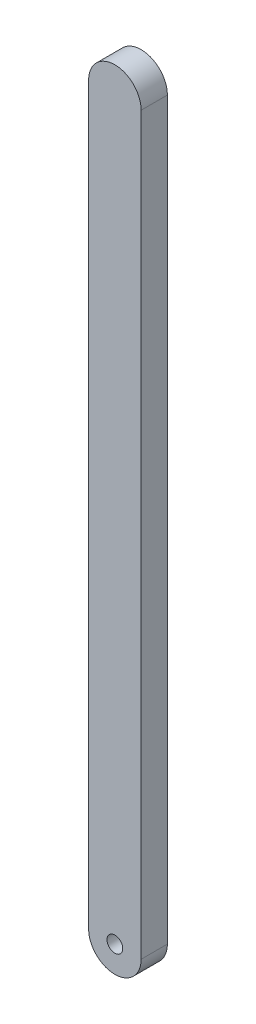
ISO-10303-21;
HEADER;
FILE_DESCRIPTION(('STEP AP214'),'2;1');
FILE_NAME('part.step','',(''),(''),'','','');
FILE_SCHEMA(('AUTOMOTIVE_DESIGN { 1 0 10303 214 1 1 1 1 }'));
ENDSEC;
DATA;
#1=APPLICATION_CONTEXT('core data for automotive mechanical design processes');
#2=APPLICATION_PROTOCOL_DEFINITION('international standard','automotive_design',2000,#1);
#3=PRODUCT_CONTEXT('',#1,'mechanical');
#4=PRODUCT('Part','Part','',(#3));
#5=PRODUCT_RELATED_PRODUCT_CATEGORY('part','',(#4));
#6=PRODUCT_DEFINITION_FORMATION('','',#4);
#7=PRODUCT_DEFINITION_CONTEXT('part definition',#1,'design');
#8=PRODUCT_DEFINITION('design','',#6,#7);
#9=PRODUCT_DEFINITION_SHAPE('','',#8);
#10=(LENGTH_UNIT() NAMED_UNIT(*) SI_UNIT(.MILLI.,.METRE.));
#11=(NAMED_UNIT(*) PLANE_ANGLE_UNIT() SI_UNIT($,.RADIAN.));
#12=(NAMED_UNIT(*) SI_UNIT($,.STERADIAN.) SOLID_ANGLE_UNIT());
#13=UNCERTAINTY_MEASURE_WITH_UNIT(LENGTH_MEASURE(1.E-05),#10,'distance_accuracy_value','');
#14=(GEOMETRIC_REPRESENTATION_CONTEXT(3) GLOBAL_UNCERTAINTY_ASSIGNED_CONTEXT((#13)) GLOBAL_UNIT_ASSIGNED_CONTEXT((#10,
#11,#12)) REPRESENTATION_CONTEXT('',''));
#15=CARTESIAN_POINT('',(0.,0.,0.));
#16=DIRECTION('',(0.,0.,1.));
#17=DIRECTION('',(1.,0.,0.));
#18=AXIS2_PLACEMENT_3D('',#15,#16,#17);
#19=CARTESIAN_POINT('',(0.,70.,0.));
#20=DIRECTION('',(0.,0.,1.));
#21=DIRECTION('',(1.,0.,0.));
#22=AXIS2_PLACEMENT_3D('',#19,#20,#21);
#23=CYLINDRICAL_SURFACE('',#22,2.5);
#24=CARTESIAN_POINT('',(0.,70.,0.));
#25=DIRECTION('',(0.,0.,1.));
#26=DIRECTION('',(1.,0.,0.));
#27=AXIS2_PLACEMENT_3D('',#24,#25,#26);
#28=CIRCLE('',#27,2.5);
#29=CARTESIAN_POINT('',(2.49999999999999,70.,0.));
#30=VERTEX_POINT('',#29);
#31=EDGE_CURVE('E105',#30,#30,#28,.T.);
#32=ORIENTED_EDGE('',*,*,#31,.F.);
#33=EDGE_LOOP('',(#32));
#34=FACE_BOUND('',#33,.T.);
#35=CARTESIAN_POINT('',(0.,70.,2.5));
#36=DIRECTION('',(0.,0.,1.));
#37=DIRECTION('',(1.,0.,0.));
#38=AXIS2_PLACEMENT_3D('',#35,#36,#37);
#39=CIRCLE('',#38,2.5);
#40=CARTESIAN_POINT('',(2.49999999999999,70.,2.5));
#41=VERTEX_POINT('',#40);
#42=EDGE_CURVE('E11',#41,#41,#39,.F.);
#43=ORIENTED_EDGE('',*,*,#42,.F.);
#44=EDGE_LOOP('',(#43));
#45=FACE_BOUND('',#44,.T.);
#46=ADVANCED_FACE('F37',(#34,#45),#23,.F.);
#47=CARTESIAN_POINT('',(0.,-70.,0.));
#48=DIRECTION('',(0.,0.,-1.));
#49=DIRECTION('',(-1.,0.,0.));
#50=AXIS2_PLACEMENT_3D('',#47,#48,#49);
#51=CYLINDRICAL_SURFACE('',#50,5.);
#52=DIRECTION('',(0.,0.,-1.));
#53=VECTOR('',#52,1.);
#54=CARTESIAN_POINT('',(-4.99999999999999,-70.,5.));
#55=LINE('',#54,#53);
#56=CARTESIAN_POINT('',(-4.99999999999999,-70.,0.));
#57=VERTEX_POINT('',#56);
#58=CARTESIAN_POINT('',(-4.99999999999999,-70.,5.));
#59=VERTEX_POINT('',#58);
#60=EDGE_CURVE('E90',#57,#59,#55,.F.);
#61=ORIENTED_EDGE('',*,*,#60,.F.);
#62=CARTESIAN_POINT('',(0.,-70.,0.));
#63=DIRECTION('',(0.,0.,1.));
#64=DIRECTION('',(1.,0.,0.));
#65=AXIS2_PLACEMENT_3D('',#62,#63,#64);
#66=CIRCLE('',#65,5.);
#67=CARTESIAN_POINT('',(5.00000000000001,-70.,0.));
#68=VERTEX_POINT('',#67);
#69=EDGE_CURVE('E59',#68,#57,#66,.F.);
#70=ORIENTED_EDGE('',*,*,#69,.F.);
#71=DIRECTION('',(0.,0.,-1.));
#72=VECTOR('',#71,1.);
#73=CARTESIAN_POINT('',(5.00000000000001,-70.,5.));
#74=LINE('',#73,#72);
#75=CARTESIAN_POINT('',(5.00000000000001,-70.,5.));
#76=VERTEX_POINT('',#75);
#77=EDGE_CURVE('E112',#76,#68,#74,.T.);
#78=ORIENTED_EDGE('',*,*,#77,.F.);
#79=CARTESIAN_POINT('',(0.,-70.,5.));
#80=DIRECTION('',(0.,0.,1.));
#81=DIRECTION('',(1.,0.,0.));
#82=AXIS2_PLACEMENT_3D('',#79,#80,#81);
#83=CIRCLE('',#82,5.);
#84=EDGE_CURVE('E46',#59,#76,#83,.T.);
#85=ORIENTED_EDGE('',*,*,#84,.F.);
#86=EDGE_LOOP('',(#61,#70,#78,#85));
#87=FACE_BOUND('',#86,.T.);
#88=ADVANCED_FACE('F40',(#87),#51,.T.);
#89=CARTESIAN_POINT('',(0.,70.,5.));
#90=DIRECTION('',(0.,0.,-1.));
#91=DIRECTION('',(-1.,0.,0.));
#92=AXIS2_PLACEMENT_3D('',#89,#90,#91);
#93=CYLINDRICAL_SURFACE('',#92,5.);
#94=DIRECTION('',(0.,0.,-1.));
#95=VECTOR('',#94,1.);
#96=CARTESIAN_POINT('',(-5.00000000000001,70.,5.));
#97=LINE('',#96,#95);
#98=CARTESIAN_POINT('',(-5.00000000000001,70.,5.));
#99=VERTEX_POINT('',#98);
#100=CARTESIAN_POINT('',(-5.00000000000001,70.,0.));
#101=VERTEX_POINT('',#100);
#102=EDGE_CURVE('E83',#99,#101,#97,.T.);
#103=ORIENTED_EDGE('',*,*,#102,.F.);
#104=CARTESIAN_POINT('',(0.,70.,5.));
#105=DIRECTION('',(0.,0.,1.));
#106=DIRECTION('',(1.,0.,0.));
#107=AXIS2_PLACEMENT_3D('',#104,#105,#106);
#108=CIRCLE('',#107,5.);
#109=CARTESIAN_POINT('',(4.99999999999999,70.,5.));
#110=VERTEX_POINT('',#109);
#111=EDGE_CURVE('E91',#110,#99,#108,.T.);
#112=ORIENTED_EDGE('',*,*,#111,.F.);
#113=DIRECTION('',(0.,0.,-1.));
#114=VECTOR('',#113,1.);
#115=CARTESIAN_POINT('',(4.99999999999999,70.,5.));
#116=LINE('',#115,#114);
#117=CARTESIAN_POINT('',(4.99999999999999,70.,0.));
#118=VERTEX_POINT('',#117);
#119=EDGE_CURVE('E86',#118,#110,#116,.F.);
#120=ORIENTED_EDGE('',*,*,#119,.F.);
#121=CARTESIAN_POINT('',(0.,70.,0.));
#122=DIRECTION('',(0.,0.,1.));
#123=DIRECTION('',(1.,0.,0.));
#124=AXIS2_PLACEMENT_3D('',#121,#122,#123);
#125=CIRCLE('',#124,5.);
#126=EDGE_CURVE('E79',#101,#118,#125,.F.);
#127=ORIENTED_EDGE('',*,*,#126,.F.);
#128=EDGE_LOOP('',(#103,#112,#120,#127));
#129=FACE_BOUND('',#128,.T.);
#130=ADVANCED_FACE('F81',(#129),#93,.T.);
#131=CARTESIAN_POINT('',(4.99999999999999,75.,5.));
#132=DIRECTION('',(-1.,0.,0.));
#133=DIRECTION('',(0.,-1.,0.));
#134=AXIS2_PLACEMENT_3D('',#131,#132,#133);
#135=PLANE('',#134);
#136=DIRECTION('',(0.,1.,0.));
#137=VECTOR('',#136,1.);
#138=CARTESIAN_POINT('',(4.99999999999999,75.,5.));
#139=LINE('',#138,#137);
#140=EDGE_CURVE('E101',#76,#110,#139,.T.);
#141=ORIENTED_EDGE('',*,*,#140,.F.);
#142=ORIENTED_EDGE('',*,*,#77,.T.);
#143=DIRECTION('',(0.,1.,0.));
#144=VECTOR('',#143,1.);
#145=CARTESIAN_POINT('',(4.99999999999999,75.,0.));
#146=LINE('',#145,#144);
#147=EDGE_CURVE('E102',#68,#118,#146,.T.);
#148=ORIENTED_EDGE('',*,*,#147,.T.);
#149=ORIENTED_EDGE('',*,*,#119,.T.);
#150=EDGE_LOOP('',(#141,#142,#148,#149));
#151=FACE_BOUND('',#150,.T.);
#152=ADVANCED_FACE('F116',(#151),#135,.F.);
#153=CARTESIAN_POINT('',(-5.00000000000001,75.,5.));
#154=DIRECTION('',(1.,0.,0.));
#155=DIRECTION('',(0.,1.,0.));
#156=AXIS2_PLACEMENT_3D('',#153,#154,#155);
#157=PLANE('',#156);
#158=DIRECTION('',(0.,-1.,0.));
#159=VECTOR('',#158,1.);
#160=CARTESIAN_POINT('',(-5.00000000000001,75.,0.));
#161=LINE('',#160,#159);
#162=EDGE_CURVE('E97',#101,#57,#161,.T.);
#163=ORIENTED_EDGE('',*,*,#162,.T.);
#164=ORIENTED_EDGE('',*,*,#60,.T.);
#165=DIRECTION('',(0.,-1.,0.));
#166=VECTOR('',#165,1.);
#167=CARTESIAN_POINT('',(-5.00000000000001,75.,5.));
#168=LINE('',#167,#166);
#169=EDGE_CURVE('E98',#99,#59,#168,.T.);
#170=ORIENTED_EDGE('',*,*,#169,.F.);
#171=ORIENTED_EDGE('',*,*,#102,.T.);
#172=EDGE_LOOP('',(#163,#164,#170,#171));
#173=FACE_BOUND('',#172,.T.);
#174=ADVANCED_FACE('F95',(#173),#157,.F.);
#175=CARTESIAN_POINT('',(0.,0.,5.));
#176=DIRECTION('',(0.,0.,1.));
#177=DIRECTION('',(1.,0.,0.));
#178=AXIS2_PLACEMENT_3D('',#175,#176,#177);
#179=PLANE('',#178);
#180=CARTESIAN_POINT('',(0.,-70.,5.));
#181=DIRECTION('',(0.,0.,1.));
#182=DIRECTION('',(1.,0.,0.));
#183=AXIS2_PLACEMENT_3D('',#180,#181,#182);
#184=CIRCLE('',#183,1.5);
#185=CARTESIAN_POINT('',(1.50000000000001,-70.,5.));
#186=VERTEX_POINT('',#185);
#187=EDGE_CURVE('E119',#186,#186,#184,.T.);
#188=ORIENTED_EDGE('',*,*,#187,.F.);
#189=EDGE_LOOP('',(#188));
#190=FACE_BOUND('',#189,.T.);
#191=ORIENTED_EDGE('',*,*,#169,.T.);
#192=ORIENTED_EDGE('',*,*,#84,.T.);
#193=ORIENTED_EDGE('',*,*,#140,.T.);
#194=ORIENTED_EDGE('',*,*,#111,.T.);
#195=EDGE_LOOP('',(#191,#192,#193,#194));
#196=FACE_BOUND('',#195,.T.);
#197=ADVANCED_FACE('F117',(#190,#196),#179,.T.);
#198=CARTESIAN_POINT('',(0.,0.,0.));
#199=DIRECTION('',(0.,0.,1.));
#200=DIRECTION('',(1.,0.,0.));
#201=AXIS2_PLACEMENT_3D('',#198,#199,#200);
#202=PLANE('',#201);
#203=ORIENTED_EDGE('',*,*,#31,.T.);
#204=EDGE_LOOP('',(#203));
#205=FACE_BOUND('',#204,.T.);
#206=CARTESIAN_POINT('',(0.,-70.,0.));
#207=DIRECTION('',(0.,0.,1.));
#208=DIRECTION('',(1.,0.,0.));
#209=AXIS2_PLACEMENT_3D('',#206,#207,#208);
#210=CIRCLE('',#209,1.5);
#211=CARTESIAN_POINT('',(1.50000000000001,-70.,0.));
#212=VERTEX_POINT('',#211);
#213=EDGE_CURVE('E122',#212,#212,#210,.T.);
#214=ORIENTED_EDGE('',*,*,#213,.T.);
#215=EDGE_LOOP('',(#214));
#216=FACE_BOUND('',#215,.T.);
#217=ORIENTED_EDGE('',*,*,#147,.F.);
#218=ORIENTED_EDGE('',*,*,#69,.T.);
#219=ORIENTED_EDGE('',*,*,#162,.F.);
#220=ORIENTED_EDGE('',*,*,#126,.T.);
#221=EDGE_LOOP('',(#217,#218,#219,#220));
#222=FACE_BOUND('',#221,.T.);
#223=ADVANCED_FACE('F100',(#205,#216,#222),#202,.F.);
#224=CARTESIAN_POINT('',(0.,-70.,0.));
#225=DIRECTION('',(0.,0.,1.));
#226=DIRECTION('',(1.,0.,0.));
#227=AXIS2_PLACEMENT_3D('',#224,#225,#226);
#228=CYLINDRICAL_SURFACE('',#227,1.5);
#229=ORIENTED_EDGE('',*,*,#213,.F.);
#230=EDGE_LOOP('',(#229));
#231=FACE_BOUND('',#230,.T.);
#232=ORIENTED_EDGE('',*,*,#187,.T.);
#233=EDGE_LOOP('',(#232));
#234=FACE_BOUND('',#233,.T.);
#235=ADVANCED_FACE('F137',(#231,#234),#228,.F.);
#236=CARTESIAN_POINT('',(0.,70.,2.5));
#237=DIRECTION('',(0.,0.,1.));
#238=DIRECTION('',(1.,0.,0.));
#239=AXIS2_PLACEMENT_3D('',#236,#237,#238);
#240=PLANE('',#239);
#241=ORIENTED_EDGE('',*,*,#42,.T.);
#242=EDGE_LOOP('',(#241));
#243=FACE_BOUND('',#242,.T.);
#244=ADVANCED_FACE('F135',(#243),#240,.F.);
#245=CLOSED_SHELL('',(#46,#88,#130,#152,#174,#197,#223,#235,#244));
#246=MANIFOLD_SOLID_BREP('B2',#245);
#247=ADVANCED_BREP_SHAPE_REPRESENTATION('',(#18,#246),#14);
#248=SHAPE_DEFINITION_REPRESENTATION(#9,#247);
ENDSEC;
END-ISO-10303-21;
